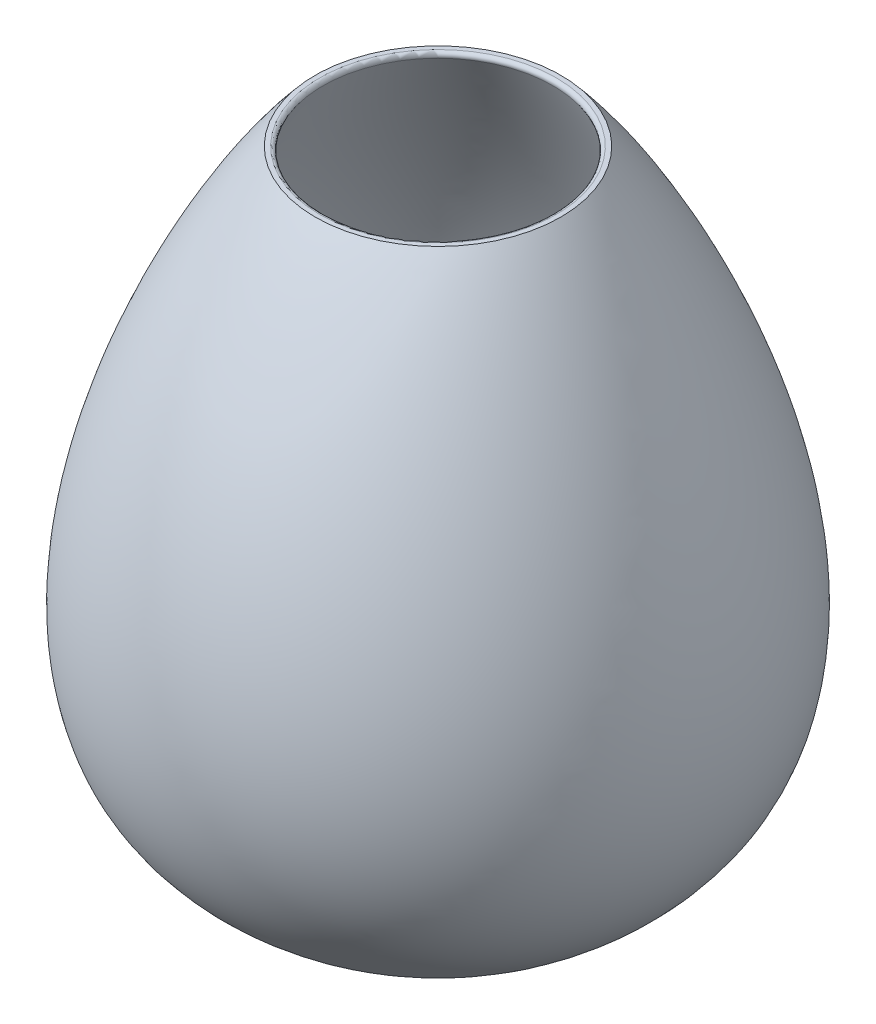
ISO-10303-21;
HEADER;
FILE_DESCRIPTION(('STEP AP214'),'2;1');
FILE_NAME('part.step','',(''),(''),'','','');
FILE_SCHEMA(('AUTOMOTIVE_DESIGN { 1 0 10303 214 1 1 1 1 }'));
ENDSEC;
DATA;
#1=APPLICATION_CONTEXT('core data for automotive mechanical design processes');
#2=APPLICATION_PROTOCOL_DEFINITION('international standard','automotive_design',2000,#1);
#3=PRODUCT_CONTEXT('',#1,'mechanical');
#4=PRODUCT('Part','Part','',(#3));
#5=PRODUCT_RELATED_PRODUCT_CATEGORY('part','',(#4));
#6=PRODUCT_DEFINITION_FORMATION('','',#4);
#7=PRODUCT_DEFINITION_CONTEXT('part definition',#1,'design');
#8=PRODUCT_DEFINITION('design','',#6,#7);
#9=PRODUCT_DEFINITION_SHAPE('','',#8);
#10=(LENGTH_UNIT() NAMED_UNIT(*) SI_UNIT(.MILLI.,.METRE.));
#11=(NAMED_UNIT(*) PLANE_ANGLE_UNIT() SI_UNIT($,.RADIAN.));
#12=(NAMED_UNIT(*) SI_UNIT($,.STERADIAN.) SOLID_ANGLE_UNIT());
#13=UNCERTAINTY_MEASURE_WITH_UNIT(LENGTH_MEASURE(1.E-05),#10,'distance_accuracy_value','');
#14=(GEOMETRIC_REPRESENTATION_CONTEXT(3) GLOBAL_UNCERTAINTY_ASSIGNED_CONTEXT((#13)) GLOBAL_UNIT_ASSIGNED_CONTEXT((#10,
#11,#12)) REPRESENTATION_CONTEXT('',''));
#15=CARTESIAN_POINT('',(0.,0.,0.));
#16=DIRECTION('',(0.,0.,1.));
#17=DIRECTION('',(1.,0.,0.));
#18=AXIS2_PLACEMENT_3D('',#15,#16,#17);
#19=CARTESIAN_POINT('',(0.,90.,0.));
#20=DIRECTION('',(0.,-1.,0.));
#21=DIRECTION('',(0.,0.,-1.));
#22=AXIS2_PLACEMENT_3D('',#19,#20,#21);
#23=PLANE('',#22);
#24=CARTESIAN_POINT('',(0.,90.,0.));
#25=DIRECTION('',(0.,-1.,0.));
#26=DIRECTION('',(0.,0.,-1.));
#27=AXIS2_PLACEMENT_3D('',#24,#25,#26);
#28=CIRCLE('',#27,16.3718179330227);
#29=CARTESIAN_POINT('',(0.,90.,-16.3718179330227));
#30=VERTEX_POINT('',#29);
#31=EDGE_CURVE('E11',#30,#30,#28,.T.);
#32=ORIENTED_EDGE('',*,*,#31,.T.);
#33=EDGE_LOOP('',(#32));
#34=FACE_BOUND('',#33,.T.);
#35=CARTESIAN_POINT('',(0.,90.,0.));
#36=DIRECTION('',(0.,1.,0.));
#37=DIRECTION('',(0.,0.,1.));
#38=AXIS2_PLACEMENT_3D('',#35,#36,#37);
#39=CIRCLE('',#38,16.9962699702503);
#40=CARTESIAN_POINT('',(0.,90.,16.9962699702503));
#41=VERTEX_POINT('',#40);
#42=EDGE_CURVE('E76',#41,#41,#39,.T.);
#43=ORIENTED_EDGE('',*,*,#42,.T.);
#44=EDGE_LOOP('',(#43));
#45=FACE_BOUND('',#44,.T.);
#46=ADVANCED_FACE('F37',(#34,#45),#23,.F.);
#47=CARTESIAN_POINT('',(15.5466529010754,90.,0.));
#48=CARTESIAN_POINT('',(21.4223943857059,78.7522205420934,0.));
#49=CARTESIAN_POINT('',(30.9821189841956,60.2072392004236,0.));
#50=CARTESIAN_POINT('',(32.6434451966248,23.7289055802628,0.));
#51=CARTESIAN_POINT('',(9.98595599231427,13.982099017259,0.));
#52=CARTESIAN_POINT('',(0.,14.6275943646092,0.));
#53=B_SPLINE_CURVE_WITH_KNOTS('',3,(#47,#48,#49,#50,#51,#52),.UNSPECIFIED.,.F.,.F.,(4,1,1,4),
(0.,0.389146130082054,0.673136551074607,1.),.UNSPECIFIED.);
#54=CARTESIAN_POINT('',(0.,116.433118832076,0.));
#55=DIRECTION('',(0.,1.,0.));
#56=AXIS1_PLACEMENT('',#54,#55);
#57=SURFACE_OF_REVOLUTION('',#53,#56);
#58=CARTESIAN_POINT('',(0.,89.2686449146156,0.));
#59=DIRECTION('',(0.,1.,0.));
#60=DIRECTION('',(0.,0.,1.));
#61=AXIS2_PLACEMENT_3D('',#58,#59,#60);
#62=CIRCLE('',#61,15.9285631254156);
#63=CARTESIAN_POINT('',(0.,89.2686449146156,15.9285631254156));
#64=VERTEX_POINT('',#63);
#65=EDGE_CURVE('E45',#64,#64,#62,.T.);
#66=ORIENTED_EDGE('',*,*,#65,.T.);
#67=EDGE_LOOP('',(#66));
#68=FACE_BOUND('',#67,.T.);
#69=CARTESIAN_POINT('',(0.,14.6275943646092,0.));
#70=VERTEX_POINT('',#69);
#71=VERTEX_LOOP('',#70);
#72=FACE_BOUND('',#71,.T.);
#73=ADVANCED_FACE('F51',(#68,#72),#57,.T.);
#74=CARTESIAN_POINT('',(0.,0.,0.));
#75=CARTESIAN_POINT('',(12.4029134604723,-0.168550614958587,0.));
#76=CARTESIAN_POINT('',(56.4587577423189,19.3982849169036,0.));
#77=CARTESIAN_POINT('',(28.120796650186,77.1434902211191,0.));
#78=CARTESIAN_POINT('',(16.9962699702503,90.,0.));
#79=B_SPLINE_CURVE_WITH_KNOTS('',3,(#74,#75,#76,#77,#78),.UNSPECIFIED.,.F.,.F.,(4,1,4),(0.,
0.332760320958915,1.),.UNSPECIFIED.);
#80=CARTESIAN_POINT('',(0.,116.433118832076,0.));
#81=DIRECTION('',(0.,1.,0.));
#82=AXIS1_PLACEMENT('',#80,#81);
#83=SURFACE_OF_REVOLUTION('',#79,#82);
#84=ORIENTED_EDGE('',*,*,#42,.F.);
#85=EDGE_LOOP('',(#84));
#86=FACE_BOUND('',#85,.T.);
#87=CARTESIAN_POINT('',(0.,0.,0.));
#88=VERTEX_POINT('',#87);
#89=VERTEX_LOOP('',#88);
#90=FACE_BOUND('',#89,.T.);
#91=ADVANCED_FACE('F53',(#86,#90),#83,.T.);
#92=CARTESIAN_POINT('',(0.,89.5,0.));
#93=DIRECTION('',(0.,1.,0.));
#94=DIRECTION('',(0.,0.,1.));
#95=AXIS2_PLACEMENT_3D('',#92,#93,#94);
#96=TOROIDAL_SURFACE('',#95,16.3718179330227,0.5);
#97=ORIENTED_EDGE('',*,*,#31,.F.);
#98=EDGE_LOOP('',(#97));
#99=FACE_BOUND('',#98,.T.);
#100=ORIENTED_EDGE('',*,*,#65,.F.);
#101=EDGE_LOOP('',(#100));
#102=FACE_BOUND('',#101,.T.);
#103=ADVANCED_FACE('F39',(#99,#102),#96,.T.);
#104=CLOSED_SHELL('',(#46,#73,#91,#103));
#105=MANIFOLD_SOLID_BREP('B2',#104);
#106=ADVANCED_BREP_SHAPE_REPRESENTATION('',(#18,#105),#14);
#107=SHAPE_DEFINITION_REPRESENTATION(#9,#106);
ENDSEC;
END-ISO-10303-21;
